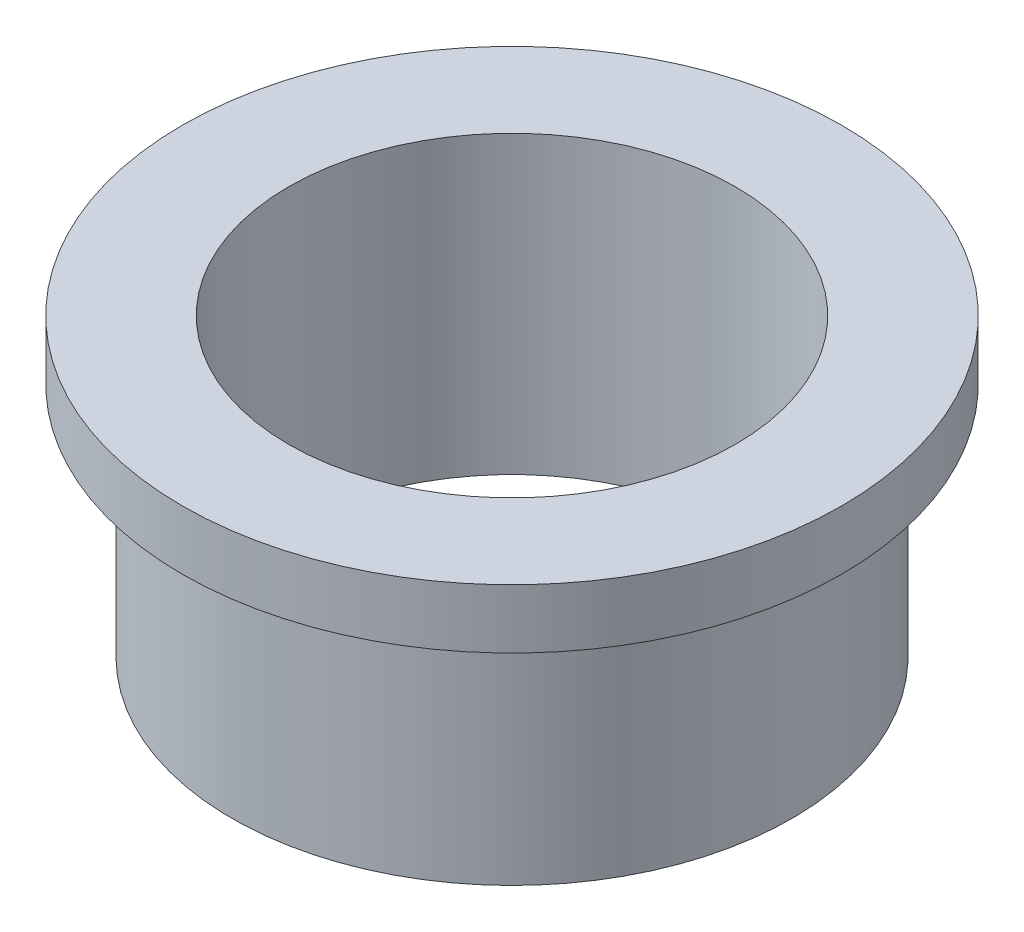
ISO-10303-21;
HEADER;
FILE_DESCRIPTION(('STEP AP214'),'2;1');
FILE_NAME('part.step','',(''),(''),'','','');
FILE_SCHEMA(('AUTOMOTIVE_DESIGN { 1 0 10303 214 1 1 1 1 }'));
ENDSEC;
DATA;
#1=APPLICATION_CONTEXT('core data for automotive mechanical design processes');
#2=APPLICATION_PROTOCOL_DEFINITION('international standard','automotive_design',2000,#1);
#3=PRODUCT_CONTEXT('',#1,'mechanical');
#4=PRODUCT('Part','Part','',(#3));
#5=PRODUCT_RELATED_PRODUCT_CATEGORY('part','',(#4));
#6=PRODUCT_DEFINITION_FORMATION('','',#4);
#7=PRODUCT_DEFINITION_CONTEXT('part definition',#1,'design');
#8=PRODUCT_DEFINITION('design','',#6,#7);
#9=PRODUCT_DEFINITION_SHAPE('','',#8);
#10=(LENGTH_UNIT() NAMED_UNIT(*) SI_UNIT(.MILLI.,.METRE.));
#11=(NAMED_UNIT(*) PLANE_ANGLE_UNIT() SI_UNIT($,.RADIAN.));
#12=(NAMED_UNIT(*) SI_UNIT($,.STERADIAN.) SOLID_ANGLE_UNIT());
#13=UNCERTAINTY_MEASURE_WITH_UNIT(LENGTH_MEASURE(1.E-05),#10,'distance_accuracy_value','');
#14=(GEOMETRIC_REPRESENTATION_CONTEXT(3) GLOBAL_UNCERTAINTY_ASSIGNED_CONTEXT((#13)) GLOBAL_UNIT_ASSIGNED_CONTEXT((#10,
#11,#12)) REPRESENTATION_CONTEXT('',''));
#15=CARTESIAN_POINT('',(0.,0.,0.));
#16=DIRECTION('',(0.,0.,1.));
#17=DIRECTION('',(1.,0.,0.));
#18=AXIS2_PLACEMENT_3D('',#15,#16,#17);
#19=CARTESIAN_POINT('',(0.,0.,0.));
#20=DIRECTION('',(0.,-1.,0.));
#21=DIRECTION('',(0.,0.,-1.));
#22=AXIS2_PLACEMENT_3D('',#19,#20,#21);
#23=PLANE('',#22);
#24=CARTESIAN_POINT('',(-6.,0.,0.));
#25=DIRECTION('',(0.,-1.,0.));
#26=DIRECTION('',(0.,0.,-1.));
#27=AXIS2_PLACEMENT_3D('',#24,#25,#26);
#28=CIRCLE('',#27,7.525);
#29=CARTESIAN_POINT('',(-6.,0.,-7.525));
#30=VERTEX_POINT('',#29);
#31=EDGE_CURVE('E44',#30,#30,#28,.T.);
#32=ORIENTED_EDGE('',*,*,#31,.T.);
#33=EDGE_LOOP('',(#32));
#34=FACE_BOUND('',#33,.T.);
#35=CARTESIAN_POINT('',(-6.,0.,0.));
#36=DIRECTION('',(0.,-1.,0.));
#37=DIRECTION('',(0.,0.,-1.));
#38=AXIS2_PLACEMENT_3D('',#35,#36,#37);
#39=CIRCLE('',#38,6.);
#40=CARTESIAN_POINT('',(-6.,0.,-6.));
#41=VERTEX_POINT('',#40);
#42=EDGE_CURVE('E65',#41,#41,#39,.T.);
#43=ORIENTED_EDGE('',*,*,#42,.F.);
#44=EDGE_LOOP('',(#43));
#45=FACE_BOUND('',#44,.T.);
#46=ADVANCED_FACE('F33',(#34,#45),#23,.T.);
#47=CARTESIAN_POINT('',(-6.,0.,0.));
#48=DIRECTION('',(0.,-1.,0.));
#49=DIRECTION('',(0.,0.,-1.));
#50=AXIS2_PLACEMENT_3D('',#47,#48,#49);
#51=CYLINDRICAL_SURFACE('',#50,7.525);
#52=CARTESIAN_POINT('',(-6.,5.6,0.));
#53=DIRECTION('',(0.,-1.,0.));
#54=DIRECTION('',(0.,0.,-1.));
#55=AXIS2_PLACEMENT_3D('',#52,#53,#54);
#56=CIRCLE('',#55,7.525);
#57=CARTESIAN_POINT('',(-6.,5.6,-7.525));
#58=VERTEX_POINT('',#57);
#59=EDGE_CURVE('E48',#58,#58,#56,.T.);
#60=ORIENTED_EDGE('',*,*,#59,.T.);
#61=EDGE_LOOP('',(#60));
#62=FACE_BOUND('',#61,.T.);
#63=ORIENTED_EDGE('',*,*,#31,.F.);
#64=EDGE_LOOP('',(#63));
#65=FACE_BOUND('',#64,.T.);
#66=ADVANCED_FACE('F72',(#62,#65),#51,.T.);
#67=CARTESIAN_POINT('',(-6.,5.6,0.));
#68=DIRECTION('',(0.,-1.,0.));
#69=DIRECTION('',(0.,0.,-1.));
#70=AXIS2_PLACEMENT_3D('',#67,#68,#69);
#71=CONICAL_SURFACE('',#70,7.525,0.523598775598303);
#72=CARTESIAN_POINT('',(-6.,5.97239092362731,0.));
#73=DIRECTION('',(0.,-1.,0.));
#74=DIRECTION('',(0.,0.,-1.));
#75=AXIS2_PLACEMENT_3D('',#72,#73,#74);
#76=CIRCLE('',#75,7.31);
#77=CARTESIAN_POINT('',(-6.,5.97239092362731,-7.31));
#78=VERTEX_POINT('',#77);
#79=EDGE_CURVE('E53',#78,#78,#76,.T.);
#80=ORIENTED_EDGE('',*,*,#79,.T.);
#81=EDGE_LOOP('',(#80));
#82=FACE_BOUND('',#81,.T.);
#83=ORIENTED_EDGE('',*,*,#59,.F.);
#84=EDGE_LOOP('',(#83));
#85=FACE_BOUND('',#84,.T.);
#86=ADVANCED_FACE('F77',(#82,#85),#71,.T.);
#87=CARTESIAN_POINT('',(-6.,0.,0.));
#88=DIRECTION('',(0.,-1.,0.));
#89=DIRECTION('',(0.,0.,-1.));
#90=AXIS2_PLACEMENT_3D('',#87,#88,#89);
#91=CYLINDRICAL_SURFACE('',#90,7.31);
#92=CARTESIAN_POINT('',(-6.,6.10239092362731,0.));
#93=DIRECTION('',(0.,-1.,0.));
#94=DIRECTION('',(0.,0.,-1.));
#95=AXIS2_PLACEMENT_3D('',#92,#93,#94);
#96=CIRCLE('',#95,7.31);
#97=CARTESIAN_POINT('',(-6.,6.10239092362731,-7.31));
#98=VERTEX_POINT('',#97);
#99=EDGE_CURVE('E40',#98,#98,#96,.T.);
#100=ORIENTED_EDGE('',*,*,#99,.T.);
#101=EDGE_LOOP('',(#100));
#102=FACE_BOUND('',#101,.T.);
#103=ORIENTED_EDGE('',*,*,#79,.F.);
#104=EDGE_LOOP('',(#103));
#105=FACE_BOUND('',#104,.T.);
#106=ADVANCED_FACE('F83',(#102,#105),#91,.T.);
#107=CARTESIAN_POINT('',(0.,6.35239092362731,0.));
#108=DIRECTION('',(0.,-1.,0.));
#109=DIRECTION('',(0.,0.,-1.));
#110=AXIS2_PLACEMENT_3D('',#107,#108,#109);
#111=PLANE('',#110);
#112=CARTESIAN_POINT('',(-6.,6.35239092362731,0.));
#113=DIRECTION('',(0.,-1.,0.));
#114=DIRECTION('',(0.,0.,-1.));
#115=AXIS2_PLACEMENT_3D('',#112,#113,#114);
#116=CIRCLE('',#115,7.56);
#117=CARTESIAN_POINT('',(-6.,6.35239092362731,-7.56));
#118=VERTEX_POINT('',#117);
#119=EDGE_CURVE('E10',#118,#118,#116,.F.);
#120=ORIENTED_EDGE('',*,*,#119,.T.);
#121=EDGE_LOOP('',(#120));
#122=FACE_BOUND('',#121,.T.);
#123=CARTESIAN_POINT('',(-6.,6.35239092362731,0.));
#124=DIRECTION('',(0.,-1.,0.));
#125=DIRECTION('',(0.,0.,-1.));
#126=AXIS2_PLACEMENT_3D('',#123,#124,#125);
#127=CIRCLE('',#126,8.86);
#128=CARTESIAN_POINT('',(-6.,6.35239092362731,-8.86));
#129=VERTEX_POINT('',#128);
#130=EDGE_CURVE('E56',#129,#129,#127,.T.);
#131=ORIENTED_EDGE('',*,*,#130,.T.);
#132=EDGE_LOOP('',(#131));
#133=FACE_BOUND('',#132,.T.);
#134=ADVANCED_FACE('F87',(#122,#133),#111,.T.);
#135=CARTESIAN_POINT('',(-6.,0.,0.));
#136=DIRECTION('',(0.,-1.,0.));
#137=DIRECTION('',(0.,0.,-1.));
#138=AXIS2_PLACEMENT_3D('',#135,#136,#137);
#139=CYLINDRICAL_SURFACE('',#138,8.86);
#140=CARTESIAN_POINT('',(-6.,7.94239092362731,0.));
#141=DIRECTION('',(0.,-1.,0.));
#142=DIRECTION('',(0.,0.,-1.));
#143=AXIS2_PLACEMENT_3D('',#140,#141,#142);
#144=CIRCLE('',#143,8.86);
#145=CARTESIAN_POINT('',(-6.,7.94239092362731,-8.86));
#146=VERTEX_POINT('',#145);
#147=EDGE_CURVE('E59',#146,#146,#144,.T.);
#148=ORIENTED_EDGE('',*,*,#147,.T.);
#149=EDGE_LOOP('',(#148));
#150=FACE_BOUND('',#149,.T.);
#151=ORIENTED_EDGE('',*,*,#130,.F.);
#152=EDGE_LOOP('',(#151));
#153=FACE_BOUND('',#152,.T.);
#154=ADVANCED_FACE('F90',(#150,#153),#139,.T.);
#155=CARTESIAN_POINT('',(0.,7.94239092362731,0.));
#156=DIRECTION('',(0.,1.,0.));
#157=DIRECTION('',(0.,0.,1.));
#158=AXIS2_PLACEMENT_3D('',#155,#156,#157);
#159=PLANE('',#158);
#160=CARTESIAN_POINT('',(-6.,7.94239092362731,0.));
#161=DIRECTION('',(0.,-1.,0.));
#162=DIRECTION('',(0.,0.,-1.));
#163=AXIS2_PLACEMENT_3D('',#160,#161,#162);
#164=CIRCLE('',#163,6.);
#165=CARTESIAN_POINT('',(-6.,7.94239092362731,-6.));
#166=VERTEX_POINT('',#165);
#167=EDGE_CURVE('E62',#166,#166,#164,.T.);
#168=ORIENTED_EDGE('',*,*,#167,.T.);
#169=EDGE_LOOP('',(#168));
#170=FACE_BOUND('',#169,.T.);
#171=ORIENTED_EDGE('',*,*,#147,.F.);
#172=EDGE_LOOP('',(#171));
#173=FACE_BOUND('',#172,.T.);
#174=ADVANCED_FACE('F93',(#170,#173),#159,.T.);
#175=CARTESIAN_POINT('',(-6.,0.,0.));
#176=DIRECTION('',(0.,-1.,0.));
#177=DIRECTION('',(0.,0.,-1.));
#178=AXIS2_PLACEMENT_3D('',#175,#176,#177);
#179=CYLINDRICAL_SURFACE('',#178,6.);
#180=ORIENTED_EDGE('',*,*,#167,.F.);
#181=EDGE_LOOP('',(#180));
#182=FACE_BOUND('',#181,.T.);
#183=ORIENTED_EDGE('',*,*,#42,.T.);
#184=EDGE_LOOP('',(#183));
#185=FACE_BOUND('',#184,.T.);
#186=ADVANCED_FACE('F69',(#182,#185),#179,.F.);
#187=CARTESIAN_POINT('',(-6.,6.10239092362731,0.));
#188=DIRECTION('',(0.,-1.,0.));
#189=DIRECTION('',(0.,0.,-1.));
#190=AXIS2_PLACEMENT_3D('',#187,#188,#189);
#191=TOROIDAL_SURFACE('',#190,7.56,0.25);
#192=ORIENTED_EDGE('',*,*,#119,.F.);
#193=EDGE_LOOP('',(#192));
#194=FACE_BOUND('',#193,.T.);
#195=ORIENTED_EDGE('',*,*,#99,.F.);
#196=EDGE_LOOP('',(#195));
#197=FACE_BOUND('',#196,.T.);
#198=ADVANCED_FACE('F35',(#194,#197),#191,.F.);
#199=CLOSED_SHELL('',(#46,#66,#86,#106,#134,#154,#174,#186,#198));
#200=MANIFOLD_SOLID_BREP('B2',#199);
#201=ADVANCED_BREP_SHAPE_REPRESENTATION('',(#18,#200),#14);
#202=SHAPE_DEFINITION_REPRESENTATION(#9,#201);
ENDSEC;
END-ISO-10303-21;
